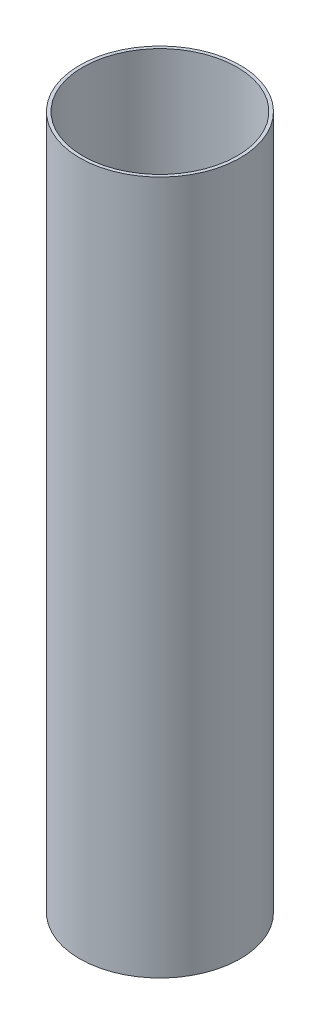
ISO-10303-21;
HEADER;
FILE_DESCRIPTION(('STEP AP214'),'2;1');
FILE_NAME('part.step','',(''),(''),'','','');
FILE_SCHEMA(('AUTOMOTIVE_DESIGN { 1 0 10303 214 1 1 1 1 }'));
ENDSEC;
DATA;
#1=APPLICATION_CONTEXT('core data for automotive mechanical design processes');
#2=APPLICATION_PROTOCOL_DEFINITION('international standard','automotive_design',2000,#1);
#3=PRODUCT_CONTEXT('',#1,'mechanical');
#4=PRODUCT('Part','Part','',(#3));
#5=PRODUCT_RELATED_PRODUCT_CATEGORY('part','',(#4));
#6=PRODUCT_DEFINITION_FORMATION('','',#4);
#7=PRODUCT_DEFINITION_CONTEXT('part definition',#1,'design');
#8=PRODUCT_DEFINITION('design','',#6,#7);
#9=PRODUCT_DEFINITION_SHAPE('','',#8);
#10=(LENGTH_UNIT() NAMED_UNIT(*) SI_UNIT(.MILLI.,.METRE.));
#11=(NAMED_UNIT(*) PLANE_ANGLE_UNIT() SI_UNIT($,.RADIAN.));
#12=(NAMED_UNIT(*) SI_UNIT($,.STERADIAN.) SOLID_ANGLE_UNIT());
#13=UNCERTAINTY_MEASURE_WITH_UNIT(LENGTH_MEASURE(1.E-05),#10,'distance_accuracy_value','');
#14=(GEOMETRIC_REPRESENTATION_CONTEXT(3) GLOBAL_UNCERTAINTY_ASSIGNED_CONTEXT((#13)) GLOBAL_UNIT_ASSIGNED_CONTEXT((#10,
#11,#12)) REPRESENTATION_CONTEXT('',''));
#15=CARTESIAN_POINT('',(0.,0.,0.));
#16=DIRECTION('',(0.,0.,1.));
#17=DIRECTION('',(1.,0.,0.));
#18=AXIS2_PLACEMENT_3D('',#15,#16,#17);
#19=CARTESIAN_POINT('',(0.,685.8,0.));
#20=DIRECTION('',(0.,1.,0.));
#21=DIRECTION('',(0.,0.,1.));
#22=AXIS2_PLACEMENT_3D('',#19,#20,#21);
#23=PLANE('',#22);
#24=CARTESIAN_POINT('',(0.,685.8,0.));
#25=DIRECTION('',(0.,1.,0.));
#26=DIRECTION('',(0.,0.,1.));
#27=AXIS2_PLACEMENT_3D('',#24,#25,#26);
#28=CIRCLE('',#27,79.375);
#29=CARTESIAN_POINT('',(0.,685.8,79.375));
#30=VERTEX_POINT('',#29);
#31=EDGE_CURVE('E10',#30,#30,#28,.T.);
#32=ORIENTED_EDGE('',*,*,#31,.T.);
#33=EDGE_LOOP('',(#32));
#34=FACE_BOUND('',#33,.T.);
#35=CARTESIAN_POINT('',(0.,685.8,0.));
#36=DIRECTION('',(0.,1.,0.));
#37=DIRECTION('',(0.,0.,1.));
#38=AXIS2_PLACEMENT_3D('',#35,#36,#37);
#39=CIRCLE('',#38,76.2);
#40=CARTESIAN_POINT('',(0.,685.8,76.2));
#41=VERTEX_POINT('',#40);
#42=EDGE_CURVE('E44',#41,#41,#39,.T.);
#43=ORIENTED_EDGE('',*,*,#42,.F.);
#44=EDGE_LOOP('',(#43));
#45=FACE_BOUND('',#44,.T.);
#46=ADVANCED_FACE('F33',(#34,#45),#23,.T.);
#47=CARTESIAN_POINT('',(0.,0.,0.));
#48=DIRECTION('',(0.,1.,0.));
#49=DIRECTION('',(0.,0.,1.));
#50=AXIS2_PLACEMENT_3D('',#47,#48,#49);
#51=PLANE('',#50);
#52=CARTESIAN_POINT('',(0.,0.,0.));
#53=DIRECTION('',(0.,1.,0.));
#54=DIRECTION('',(0.,0.,1.));
#55=AXIS2_PLACEMENT_3D('',#52,#53,#54);
#56=CIRCLE('',#55,79.375);
#57=CARTESIAN_POINT('',(0.,0.,79.375));
#58=VERTEX_POINT('',#57);
#59=EDGE_CURVE('E37',#58,#58,#56,.T.);
#60=ORIENTED_EDGE('',*,*,#59,.F.);
#61=EDGE_LOOP('',(#60));
#62=FACE_BOUND('',#61,.T.);
#63=CARTESIAN_POINT('',(0.,0.,0.));
#64=DIRECTION('',(0.,1.,0.));
#65=DIRECTION('',(0.,0.,1.));
#66=AXIS2_PLACEMENT_3D('',#63,#64,#65);
#67=CIRCLE('',#66,76.2);
#68=CARTESIAN_POINT('',(0.,0.,76.2));
#69=VERTEX_POINT('',#68);
#70=EDGE_CURVE('E46',#69,#69,#67,.T.);
#71=ORIENTED_EDGE('',*,*,#70,.T.);
#72=EDGE_LOOP('',(#71));
#73=FACE_BOUND('',#72,.T.);
#74=ADVANCED_FACE('F56',(#62,#73),#51,.F.);
#75=CARTESIAN_POINT('',(0.,685.8,0.));
#76=DIRECTION('',(0.,-1.,0.));
#77=DIRECTION('',(0.,0.,-1.));
#78=AXIS2_PLACEMENT_3D('',#75,#76,#77);
#79=CYLINDRICAL_SURFACE('',#78,79.375);
#80=ORIENTED_EDGE('',*,*,#31,.F.);
#81=EDGE_LOOP('',(#80));
#82=FACE_BOUND('',#81,.T.);
#83=ORIENTED_EDGE('',*,*,#59,.T.);
#84=EDGE_LOOP('',(#83));
#85=FACE_BOUND('',#84,.T.);
#86=ADVANCED_FACE('F35',(#82,#85),#79,.T.);
#87=CARTESIAN_POINT('',(0.,685.8,0.));
#88=DIRECTION('',(0.,-1.,0.));
#89=DIRECTION('',(0.,0.,-1.));
#90=AXIS2_PLACEMENT_3D('',#87,#88,#89);
#91=CYLINDRICAL_SURFACE('',#90,76.2);
#92=ORIENTED_EDGE('',*,*,#42,.T.);
#93=EDGE_LOOP('',(#92));
#94=FACE_BOUND('',#93,.T.);
#95=ORIENTED_EDGE('',*,*,#70,.F.);
#96=EDGE_LOOP('',(#95));
#97=FACE_BOUND('',#96,.T.);
#98=ADVANCED_FACE('F52',(#94,#97),#91,.F.);
#99=CLOSED_SHELL('',(#46,#74,#86,#98));
#100=MANIFOLD_SOLID_BREP('B2',#99);
#101=ADVANCED_BREP_SHAPE_REPRESENTATION('',(#18,#100),#14);
#102=SHAPE_DEFINITION_REPRESENTATION(#9,#101);
ENDSEC;
END-ISO-10303-21;
